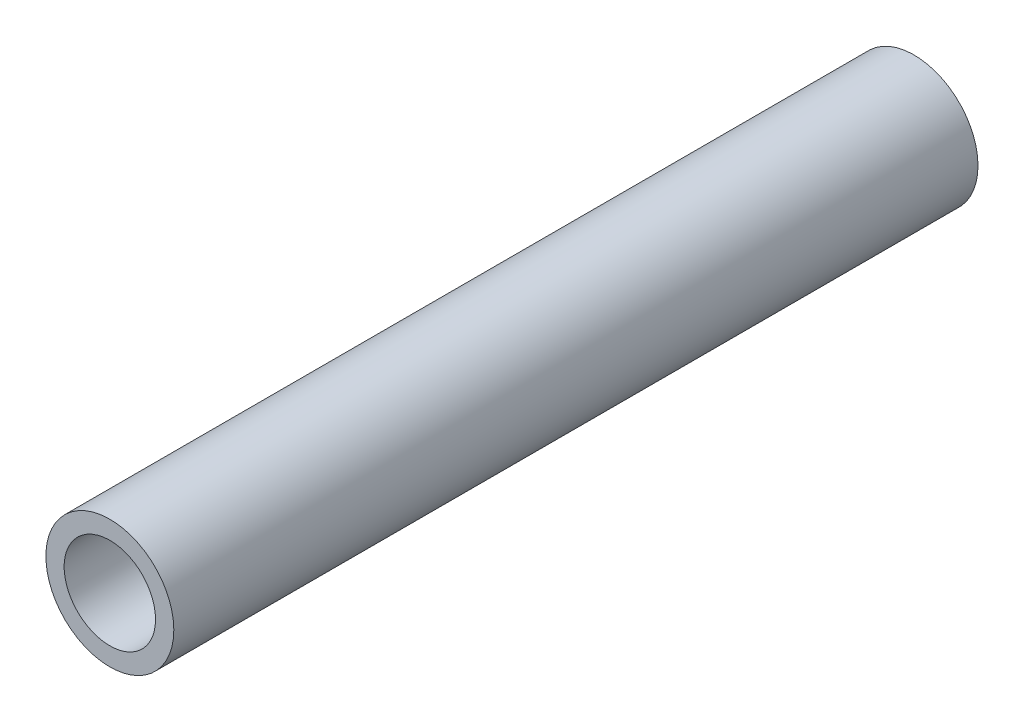
ISO-10303-21;
HEADER;
FILE_DESCRIPTION(('STEP AP214'),'2;1');
FILE_NAME('part.step','',(''),(''),'','','');
FILE_SCHEMA(('AUTOMOTIVE_DESIGN { 1 0 10303 214 1 1 1 1 }'));
ENDSEC;
DATA;
#1=APPLICATION_CONTEXT('core data for automotive mechanical design processes');
#2=APPLICATION_PROTOCOL_DEFINITION('international standard','automotive_design',2000,#1);
#3=PRODUCT_CONTEXT('',#1,'mechanical');
#4=PRODUCT('Part','Part','',(#3));
#5=PRODUCT_RELATED_PRODUCT_CATEGORY('part','',(#4));
#6=PRODUCT_DEFINITION_FORMATION('','',#4);
#7=PRODUCT_DEFINITION_CONTEXT('part definition',#1,'design');
#8=PRODUCT_DEFINITION('design','',#6,#7);
#9=PRODUCT_DEFINITION_SHAPE('','',#8);
#10=(LENGTH_UNIT() NAMED_UNIT(*) SI_UNIT(.MILLI.,.METRE.));
#11=(NAMED_UNIT(*) PLANE_ANGLE_UNIT() SI_UNIT($,.RADIAN.));
#12=(NAMED_UNIT(*) SI_UNIT($,.STERADIAN.) SOLID_ANGLE_UNIT());
#13=UNCERTAINTY_MEASURE_WITH_UNIT(LENGTH_MEASURE(1.E-05),#10,'distance_accuracy_value','');
#14=(GEOMETRIC_REPRESENTATION_CONTEXT(3) GLOBAL_UNCERTAINTY_ASSIGNED_CONTEXT((#13)) GLOBAL_UNIT_ASSIGNED_CONTEXT((#10,
#11,#12)) REPRESENTATION_CONTEXT('',''));
#15=CARTESIAN_POINT('',(0.,0.,0.));
#16=DIRECTION('',(0.,0.,1.));
#17=DIRECTION('',(1.,0.,0.));
#18=AXIS2_PLACEMENT_3D('',#15,#16,#17);
#19=CARTESIAN_POINT('',(0.,0.,-139.7));
#20=DIRECTION('',(0.,0.,1.));
#21=DIRECTION('',(1.,0.,0.));
#22=AXIS2_PLACEMENT_3D('',#19,#20,#21);
#23=CYLINDRICAL_SURFACE('',#22,11.1125);
#24=CARTESIAN_POINT('',(0.,0.,-139.7));
#25=DIRECTION('',(0.,0.,1.));
#26=DIRECTION('',(1.,0.,0.));
#27=AXIS2_PLACEMENT_3D('',#24,#25,#26);
#28=CIRCLE('',#27,11.1125);
#29=CARTESIAN_POINT('',(11.1125,0.,-139.7));
#30=VERTEX_POINT('',#29);
#31=EDGE_CURVE('E10',#30,#30,#28,.T.);
#32=ORIENTED_EDGE('',*,*,#31,.T.);
#33=EDGE_LOOP('',(#32));
#34=FACE_BOUND('',#33,.T.);
#35=CARTESIAN_POINT('',(0.,0.,0.));
#36=DIRECTION('',(0.,0.,1.));
#37=DIRECTION('',(1.,0.,0.));
#38=AXIS2_PLACEMENT_3D('',#35,#36,#37);
#39=CIRCLE('',#38,11.1125);
#40=CARTESIAN_POINT('',(11.1125,0.,0.));
#41=VERTEX_POINT('',#40);
#42=EDGE_CURVE('E35',#41,#41,#39,.T.);
#43=ORIENTED_EDGE('',*,*,#42,.F.);
#44=EDGE_LOOP('',(#43));
#45=FACE_BOUND('',#44,.T.);
#46=ADVANCED_FACE('F32',(#34,#45),#23,.T.);
#47=CARTESIAN_POINT('',(0.,0.,-139.7));
#48=DIRECTION('',(0.,0.,1.));
#49=DIRECTION('',(1.,0.,0.));
#50=AXIS2_PLACEMENT_3D('',#47,#48,#49);
#51=PLANE('',#50);
#52=CARTESIAN_POINT('',(0.,0.,-139.7));
#53=DIRECTION('',(0.,0.,1.));
#54=DIRECTION('',(1.,0.,0.));
#55=AXIS2_PLACEMENT_3D('',#52,#53,#54);
#56=CIRCLE('',#55,7.9375);
#57=CARTESIAN_POINT('',(7.9375,0.,-139.7));
#58=VERTEX_POINT('',#57);
#59=EDGE_CURVE('E42',#58,#58,#56,.T.);
#60=ORIENTED_EDGE('',*,*,#59,.T.);
#61=EDGE_LOOP('',(#60));
#62=FACE_BOUND('',#61,.T.);
#63=ORIENTED_EDGE('',*,*,#31,.F.);
#64=EDGE_LOOP('',(#63));
#65=FACE_BOUND('',#64,.T.);
#66=ADVANCED_FACE('F50',(#62,#65),#51,.F.);
#67=CARTESIAN_POINT('',(0.,0.,0.));
#68=DIRECTION('',(0.,0.,1.));
#69=DIRECTION('',(1.,0.,0.));
#70=AXIS2_PLACEMENT_3D('',#67,#68,#69);
#71=PLANE('',#70);
#72=CARTESIAN_POINT('',(0.,0.,0.));
#73=DIRECTION('',(0.,0.,1.));
#74=DIRECTION('',(1.,0.,0.));
#75=AXIS2_PLACEMENT_3D('',#72,#73,#74);
#76=CIRCLE('',#75,7.9375);
#77=CARTESIAN_POINT('',(7.9375,0.,0.));
#78=VERTEX_POINT('',#77);
#79=EDGE_CURVE('E44',#78,#78,#76,.T.);
#80=ORIENTED_EDGE('',*,*,#79,.F.);
#81=EDGE_LOOP('',(#80));
#82=FACE_BOUND('',#81,.T.);
#83=ORIENTED_EDGE('',*,*,#42,.T.);
#84=EDGE_LOOP('',(#83));
#85=FACE_BOUND('',#84,.T.);
#86=ADVANCED_FACE('F56',(#82,#85),#71,.T.);
#87=CARTESIAN_POINT('',(0.,0.,-139.7));
#88=DIRECTION('',(0.,0.,1.));
#89=DIRECTION('',(1.,0.,0.));
#90=AXIS2_PLACEMENT_3D('',#87,#88,#89);
#91=CYLINDRICAL_SURFACE('',#90,7.9375);
#92=ORIENTED_EDGE('',*,*,#59,.F.);
#93=EDGE_LOOP('',(#92));
#94=FACE_BOUND('',#93,.T.);
#95=ORIENTED_EDGE('',*,*,#79,.T.);
#96=EDGE_LOOP('',(#95));
#97=FACE_BOUND('',#96,.T.);
#98=ADVANCED_FACE('F53',(#94,#97),#91,.F.);
#99=CLOSED_SHELL('',(#46,#66,#86,#98));
#100=MANIFOLD_SOLID_BREP('B2',#99);
#101=ADVANCED_BREP_SHAPE_REPRESENTATION('',(#18,#100),#14);
#102=SHAPE_DEFINITION_REPRESENTATION(#9,#101);
ENDSEC;
END-ISO-10303-21;
